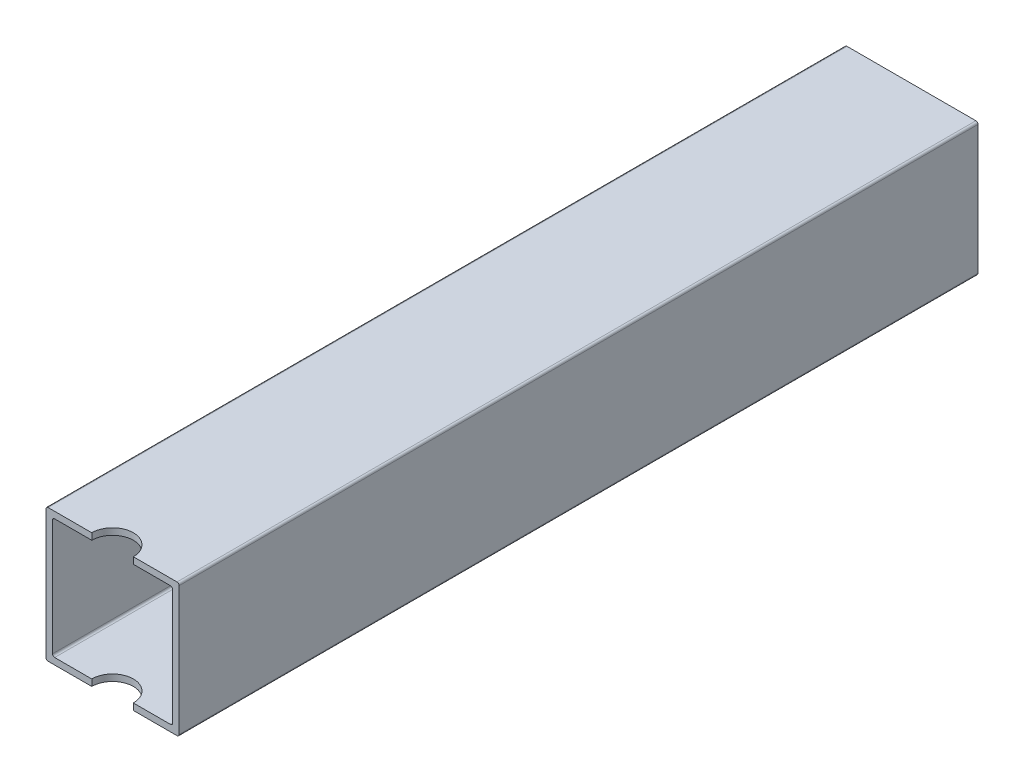
ISO-10303-21;
HEADER;
FILE_DESCRIPTION(('STEP AP214'),'2;1');
FILE_NAME('part.step','',(''),(''),'','','');
FILE_SCHEMA(('AUTOMOTIVE_DESIGN { 1 0 10303 214 1 1 1 1 }'));
ENDSEC;
DATA;
#1=APPLICATION_CONTEXT('core data for automotive mechanical design processes');
#2=APPLICATION_PROTOCOL_DEFINITION('international standard','automotive_design',2000,#1);
#3=PRODUCT_CONTEXT('',#1,'mechanical');
#4=PRODUCT('Part','Part','',(#3));
#5=PRODUCT_RELATED_PRODUCT_CATEGORY('part','',(#4));
#6=PRODUCT_DEFINITION_FORMATION('','',#4);
#7=PRODUCT_DEFINITION_CONTEXT('part definition',#1,'design');
#8=PRODUCT_DEFINITION('design','',#6,#7);
#9=PRODUCT_DEFINITION_SHAPE('','',#8);
#10=(LENGTH_UNIT() NAMED_UNIT(*) SI_UNIT(.MILLI.,.METRE.));
#11=(NAMED_UNIT(*) PLANE_ANGLE_UNIT() SI_UNIT($,.RADIAN.));
#12=(NAMED_UNIT(*) SI_UNIT($,.STERADIAN.) SOLID_ANGLE_UNIT());
#13=UNCERTAINTY_MEASURE_WITH_UNIT(LENGTH_MEASURE(1.E-05),#10,'distance_accuracy_value','');
#14=(GEOMETRIC_REPRESENTATION_CONTEXT(3) GLOBAL_UNCERTAINTY_ASSIGNED_CONTEXT((#13)) GLOBAL_UNIT_ASSIGNED_CONTEXT((#10,
#11,#12)) REPRESENTATION_CONTEXT('',''));
#15=CARTESIAN_POINT('',(0.,0.,0.));
#16=DIRECTION('',(0.,0.,1.));
#17=DIRECTION('',(1.,0.,0.));
#18=AXIS2_PLACEMENT_3D('',#15,#16,#17);
#19=CARTESIAN_POINT('',(0.,0.,0.));
#20=DIRECTION('',(0.,0.,-1.));
#21=DIRECTION('',(-1.,0.,0.));
#22=AXIS2_PLACEMENT_3D('',#19,#20,#21);
#23=PLANE('',#22);
#24=DIRECTION('',(1.,0.,0.));
#25=VECTOR('',#24,1.);
#26=CARTESIAN_POINT('',(0.,0.,0.));
#27=LINE('',#26,#25);
#28=CARTESIAN_POINT('',(0.4064,0.,0.));
#29=VERTEX_POINT('',#28);
#30=CARTESIAN_POINT('',(8.73125,0.,0.));
#31=VERTEX_POINT('',#30);
#32=EDGE_CURVE('E208',#29,#31,#27,.T.);
#33=ORIENTED_EDGE('',*,*,#32,.T.);
#34=DIRECTION('',(0.,1.,0.));
#35=VECTOR('',#34,1.);
#36=CARTESIAN_POINT('',(8.73125,0.,0.));
#37=LINE('',#36,#35);
#38=CARTESIAN_POINT('',(8.73125,1.2446,0.));
#39=VERTEX_POINT('',#38);
#40=EDGE_CURVE('E183',#31,#39,#37,.T.);
#41=ORIENTED_EDGE('',*,*,#40,.T.);
#42=DIRECTION('',(1.,0.,0.));
#43=VECTOR('',#42,1.);
#44=CARTESIAN_POINT('',(1.2446,1.2446,0.));
#45=LINE('',#44,#43);
#46=CARTESIAN_POINT('',(1.651,1.2446,0.));
#47=VERTEX_POINT('',#46);
#48=EDGE_CURVE('E355',#47,#39,#45,.T.);
#49=ORIENTED_EDGE('',*,*,#48,.F.);
#50=CARTESIAN_POINT('',(1.651,1.651,0.));
#51=DIRECTION('',(0.,0.,-1.));
#52=DIRECTION('',(-1.,0.,0.));
#53=AXIS2_PLACEMENT_3D('',#50,#51,#52);
#54=CIRCLE('',#53,0.4064);
#55=CARTESIAN_POINT('',(1.2446,1.651,0.));
#56=VERTEX_POINT('',#55);
#57=EDGE_CURVE('E325',#47,#56,#54,.T.);
#58=ORIENTED_EDGE('',*,*,#57,.T.);
#59=DIRECTION('',(0.,-1.,0.));
#60=VECTOR('',#59,1.);
#61=CARTESIAN_POINT('',(1.2446,1.2446,0.));
#62=LINE('',#61,#60);
#63=CARTESIAN_POINT('',(1.2446,23.749,0.));
#64=VERTEX_POINT('',#63);
#65=EDGE_CURVE('E354',#64,#56,#62,.T.);
#66=ORIENTED_EDGE('',*,*,#65,.F.);
#67=CARTESIAN_POINT('',(1.651,23.749,0.));
#68=DIRECTION('',(0.,0.,-1.));
#69=DIRECTION('',(-1.,0.,0.));
#70=AXIS2_PLACEMENT_3D('',#67,#68,#69);
#71=CIRCLE('',#70,0.4064);
#72=CARTESIAN_POINT('',(1.651,24.1554,0.));
#73=VERTEX_POINT('',#72);
#74=EDGE_CURVE('E306',#64,#73,#71,.T.);
#75=ORIENTED_EDGE('',*,*,#74,.T.);
#76=DIRECTION('',(-1.,0.,0.));
#77=VECTOR('',#76,1.);
#78=CARTESIAN_POINT('',(1.2446,24.1554,0.));
#79=LINE('',#78,#77);
#80=CARTESIAN_POINT('',(8.73125,24.1554,0.));
#81=VERTEX_POINT('',#80);
#82=EDGE_CURVE('E373',#81,#73,#79,.T.);
#83=ORIENTED_EDGE('',*,*,#82,.F.);
#84=CARTESIAN_POINT('',(8.73125,25.4,0.));
#85=VERTEX_POINT('',#84);
#86=EDGE_CURVE('E61',#81,#85,#37,.T.);
#87=ORIENTED_EDGE('',*,*,#86,.T.);
#88=DIRECTION('',(-1.,0.,0.));
#89=VECTOR('',#88,1.);
#90=CARTESIAN_POINT('',(0.,25.4,0.));
#91=LINE('',#90,#89);
#92=CARTESIAN_POINT('',(0.4064,25.4,0.));
#93=VERTEX_POINT('',#92);
#94=EDGE_CURVE('E222',#85,#93,#91,.T.);
#95=ORIENTED_EDGE('',*,*,#94,.T.);
#96=CARTESIAN_POINT('',(0.4064,24.9936,0.));
#97=DIRECTION('',(0.,0.,-1.));
#98=DIRECTION('',(-1.,0.,0.));
#99=AXIS2_PLACEMENT_3D('',#96,#97,#98);
#100=CIRCLE('',#99,0.4064);
#101=CARTESIAN_POINT('',(0.,24.9936,0.));
#102=VERTEX_POINT('',#101);
#103=EDGE_CURVE('E238',#93,#102,#100,.F.);
#104=ORIENTED_EDGE('',*,*,#103,.T.);
#105=DIRECTION('',(0.,-1.,0.));
#106=VECTOR('',#105,1.);
#107=CARTESIAN_POINT('',(0.,0.,0.));
#108=LINE('',#107,#106);
#109=CARTESIAN_POINT('',(0.,0.4064,0.));
#110=VERTEX_POINT('',#109);
#111=EDGE_CURVE('E209',#102,#110,#108,.T.);
#112=ORIENTED_EDGE('',*,*,#111,.T.);
#113=CARTESIAN_POINT('',(0.4064,0.4064,0.));
#114=DIRECTION('',(0.,0.,-1.));
#115=DIRECTION('',(-1.,0.,0.));
#116=AXIS2_PLACEMENT_3D('',#113,#114,#115);
#117=CIRCLE('',#116,0.4064);
#118=EDGE_CURVE('E244',#110,#29,#117,.F.);
#119=ORIENTED_EDGE('',*,*,#118,.T.);
#120=EDGE_LOOP('',(#33,#41,#49,#58,#66,#75,#83,#87,#95,#104,#112,#119));
#121=FACE_BOUND('',#120,.T.);
#122=ADVANCED_FACE('F45',(#121),#23,.F.);
#123=CARTESIAN_POINT('',(0.,0.,-152.4));
#124=DIRECTION('',(-1.,0.,0.));
#125=DIRECTION('',(0.,0.,1.));
#126=AXIS2_PLACEMENT_3D('',#123,#124,#125);
#127=PLANE('',#126);
#128=DIRECTION('',(0.,-1.,0.));
#129=VECTOR('',#128,1.);
#130=CARTESIAN_POINT('',(0.,0.,-152.4));
#131=LINE('',#130,#129);
#132=CARTESIAN_POINT('',(0.,24.9936,-152.4));
#133=VERTEX_POINT('',#132);
#134=CARTESIAN_POINT('',(0.,0.4064,-152.4));
#135=VERTEX_POINT('',#134);
#136=EDGE_CURVE('E226',#133,#135,#131,.T.);
#137=ORIENTED_EDGE('',*,*,#136,.T.);
#138=DIRECTION('',(0.,0.,1.));
#139=VECTOR('',#138,1.);
#140=CARTESIAN_POINT('',(0.,0.4064,-152.4));
#141=LINE('',#140,#139);
#142=EDGE_CURVE('E230',#135,#110,#141,.T.);
#143=ORIENTED_EDGE('',*,*,#142,.T.);
#144=ORIENTED_EDGE('',*,*,#111,.F.);
#145=DIRECTION('',(0.,0.,1.));
#146=VECTOR('',#145,1.);
#147=CARTESIAN_POINT('',(0.,24.9936,-152.4));
#148=LINE('',#147,#146);
#149=EDGE_CURVE('E227',#102,#133,#148,.F.);
#150=ORIENTED_EDGE('',*,*,#149,.T.);
#151=EDGE_LOOP('',(#137,#143,#144,#150));
#152=FACE_BOUND('',#151,.T.);
#153=ADVANCED_FACE('F405',(#152),#127,.T.);
#154=CARTESIAN_POINT('',(0.,25.4,-152.4));
#155=DIRECTION('',(0.,1.,0.));
#156=DIRECTION('',(0.,0.,1.));
#157=AXIS2_PLACEMENT_3D('',#154,#155,#156);
#158=PLANE('',#157);
#159=CARTESIAN_POINT('',(12.7,25.4,0.));
#160=DIRECTION('',(0.,1.,0.));
#161=DIRECTION('',(0.,0.,1.));
#162=AXIS2_PLACEMENT_3D('',#159,#160,#161);
#163=CIRCLE('',#162,3.96875);
#164=CARTESIAN_POINT('',(16.66875,25.4,0.));
#165=VERTEX_POINT('',#164);
#166=EDGE_CURVE('E189',#165,#85,#163,.T.);
#167=ORIENTED_EDGE('',*,*,#166,.F.);
#168=CARTESIAN_POINT('',(24.9936,25.4,0.));
#169=VERTEX_POINT('',#168);
#170=EDGE_CURVE('E223',#169,#165,#91,.T.);
#171=ORIENTED_EDGE('',*,*,#170,.F.);
#172=DIRECTION('',(0.,0.,1.));
#173=VECTOR('',#172,1.);
#174=CARTESIAN_POINT('',(24.9936,25.4,-152.4));
#175=LINE('',#174,#173);
#176=CARTESIAN_POINT('',(24.9936,25.4,-152.4));
#177=VERTEX_POINT('',#176);
#178=EDGE_CURVE('E271',#169,#177,#175,.F.);
#179=ORIENTED_EDGE('',*,*,#178,.T.);
#180=DIRECTION('',(-1.,0.,0.));
#181=VECTOR('',#180,1.);
#182=CARTESIAN_POINT('',(0.,25.4,-152.4));
#183=LINE('',#182,#181);
#184=CARTESIAN_POINT('',(0.4064,25.4,-152.4));
#185=VERTEX_POINT('',#184);
#186=EDGE_CURVE('E231',#177,#185,#183,.T.);
#187=ORIENTED_EDGE('',*,*,#186,.T.);
#188=DIRECTION('',(0.,0.,1.));
#189=VECTOR('',#188,1.);
#190=CARTESIAN_POINT('',(0.4064,25.4,-152.4));
#191=LINE('',#190,#189);
#192=EDGE_CURVE('E274',#185,#93,#191,.T.);
#193=ORIENTED_EDGE('',*,*,#192,.T.);
#194=ORIENTED_EDGE('',*,*,#94,.F.);
#195=EDGE_LOOP('',(#167,#171,#179,#187,#193,#194));
#196=FACE_BOUND('',#195,.T.);
#197=ADVANCED_FACE('F393',(#196),#158,.T.);
#198=CARTESIAN_POINT('',(25.4,0.,-152.4));
#199=DIRECTION('',(1.,0.,0.));
#200=DIRECTION('',(0.,0.,-1.));
#201=AXIS2_PLACEMENT_3D('',#198,#199,#200);
#202=PLANE('',#201);
#203=DIRECTION('',(0.,1.,0.));
#204=VECTOR('',#203,1.);
#205=CARTESIAN_POINT('',(25.4,0.,0.));
#206=LINE('',#205,#204);
#207=CARTESIAN_POINT('',(25.4,0.4064,0.));
#208=VERTEX_POINT('',#207);
#209=CARTESIAN_POINT('',(25.4,24.9936,0.));
#210=VERTEX_POINT('',#209);
#211=EDGE_CURVE('E213',#208,#210,#206,.T.);
#212=ORIENTED_EDGE('',*,*,#211,.F.);
#213=DIRECTION('',(0.,0.,1.));
#214=VECTOR('',#213,1.);
#215=CARTESIAN_POINT('',(25.4,0.4064,-152.4));
#216=LINE('',#215,#214);
#217=CARTESIAN_POINT('',(25.4,0.4064,-152.4));
#218=VERTEX_POINT('',#217);
#219=EDGE_CURVE('E268',#208,#218,#216,.F.);
#220=ORIENTED_EDGE('',*,*,#219,.T.);
#221=DIRECTION('',(0.,1.,0.));
#222=VECTOR('',#221,1.);
#223=CARTESIAN_POINT('',(25.4,0.,-152.4));
#224=LINE('',#223,#222);
#225=CARTESIAN_POINT('',(25.4,24.9936,-152.4));
#226=VERTEX_POINT('',#225);
#227=EDGE_CURVE('E384',#218,#226,#224,.T.);
#228=ORIENTED_EDGE('',*,*,#227,.T.);
#229=DIRECTION('',(0.,0.,1.));
#230=VECTOR('',#229,1.);
#231=CARTESIAN_POINT('',(25.4,24.9936,-152.4));
#232=LINE('',#231,#230);
#233=EDGE_CURVE('E264',#226,#210,#232,.T.);
#234=ORIENTED_EDGE('',*,*,#233,.T.);
#235=EDGE_LOOP('',(#212,#220,#228,#234));
#236=FACE_BOUND('',#235,.T.);
#237=ADVANCED_FACE('F420',(#236),#202,.T.);
#238=CARTESIAN_POINT('',(0.,0.,-152.4));
#239=DIRECTION('',(0.,-1.,0.));
#240=DIRECTION('',(0.,0.,-1.));
#241=AXIS2_PLACEMENT_3D('',#238,#239,#240);
#242=PLANE('',#241);
#243=CARTESIAN_POINT('',(12.7,0.,0.));
#244=DIRECTION('',(0.,1.,0.));
#245=DIRECTION('',(0.,0.,1.));
#246=AXIS2_PLACEMENT_3D('',#243,#244,#245);
#247=CIRCLE('',#246,3.96875);
#248=CARTESIAN_POINT('',(16.66875,0.,0.));
#249=VERTEX_POINT('',#248);
#250=EDGE_CURVE('E180',#249,#31,#247,.T.);
#251=ORIENTED_EDGE('',*,*,#250,.T.);
#252=ORIENTED_EDGE('',*,*,#32,.F.);
#253=DIRECTION('',(0.,0.,1.));
#254=VECTOR('',#253,1.);
#255=CARTESIAN_POINT('',(0.4064,0.,-152.4));
#256=LINE('',#255,#254);
#257=CARTESIAN_POINT('',(0.4064,0.,-152.4));
#258=VERTEX_POINT('',#257);
#259=EDGE_CURVE('E249',#29,#258,#256,.F.);
#260=ORIENTED_EDGE('',*,*,#259,.T.);
#261=DIRECTION('',(1.,0.,0.));
#262=VECTOR('',#261,1.);
#263=CARTESIAN_POINT('',(0.,0.,-152.4));
#264=LINE('',#263,#262);
#265=CARTESIAN_POINT('',(24.9936,0.,-152.4));
#266=VERTEX_POINT('',#265);
#267=EDGE_CURVE('E381',#258,#266,#264,.T.);
#268=ORIENTED_EDGE('',*,*,#267,.T.);
#269=DIRECTION('',(0.,0.,1.));
#270=VECTOR('',#269,1.);
#271=CARTESIAN_POINT('',(24.9936,0.,-152.4));
#272=LINE('',#271,#270);
#273=CARTESIAN_POINT('',(24.9936,0.,0.));
#274=VERTEX_POINT('',#273);
#275=EDGE_CURVE('E206',#266,#274,#272,.T.);
#276=ORIENTED_EDGE('',*,*,#275,.T.);
#277=EDGE_CURVE('E195',#249,#274,#27,.T.);
#278=ORIENTED_EDGE('',*,*,#277,.F.);
#279=EDGE_LOOP('',(#251,#252,#260,#268,#276,#278));
#280=FACE_BOUND('',#279,.T.);
#281=ADVANCED_FACE('F203',(#280),#242,.T.);
#282=CARTESIAN_POINT('',(0.,0.,-152.4));
#283=DIRECTION('',(0.,0.,-1.));
#284=DIRECTION('',(-1.,0.,0.));
#285=AXIS2_PLACEMENT_3D('',#282,#283,#284);
#286=PLANE('',#285);
#287=DIRECTION('',(-1.,0.,0.));
#288=VECTOR('',#287,1.);
#289=CARTESIAN_POINT('',(1.2446,24.1554,-152.4));
#290=LINE('',#289,#288);
#291=CARTESIAN_POINT('',(23.749,24.1554,-152.4));
#292=VERTEX_POINT('',#291);
#293=CARTESIAN_POINT('',(1.651,24.1554,-152.4));
#294=VERTEX_POINT('',#293);
#295=EDGE_CURVE('E215',#292,#294,#290,.T.);
#296=ORIENTED_EDGE('',*,*,#295,.T.);
#297=CARTESIAN_POINT('',(1.651,23.749,-152.4));
#298=DIRECTION('',(0.,0.,-1.));
#299=DIRECTION('',(-1.,0.,0.));
#300=AXIS2_PLACEMENT_3D('',#297,#298,#299);
#301=CIRCLE('',#300,0.4064);
#302=CARTESIAN_POINT('',(1.2446,23.749,-152.4));
#303=VERTEX_POINT('',#302);
#304=EDGE_CURVE('E310',#294,#303,#301,.F.);
#305=ORIENTED_EDGE('',*,*,#304,.T.);
#306=DIRECTION('',(0.,-1.,0.));
#307=VECTOR('',#306,1.);
#308=CARTESIAN_POINT('',(1.2446,1.2446,-152.4));
#309=LINE('',#308,#307);
#310=CARTESIAN_POINT('',(1.2446,1.651,-152.4));
#311=VERTEX_POINT('',#310);
#312=EDGE_CURVE('E339',#303,#311,#309,.T.);
#313=ORIENTED_EDGE('',*,*,#312,.T.);
#314=CARTESIAN_POINT('',(1.651,1.651,-152.4));
#315=DIRECTION('',(0.,0.,-1.));
#316=DIRECTION('',(-1.,0.,0.));
#317=AXIS2_PLACEMENT_3D('',#314,#315,#316);
#318=CIRCLE('',#317,0.4064);
#319=CARTESIAN_POINT('',(1.651,1.2446,-152.4));
#320=VERTEX_POINT('',#319);
#321=EDGE_CURVE('E54',#311,#320,#318,.F.);
#322=ORIENTED_EDGE('',*,*,#321,.T.);
#323=DIRECTION('',(1.,0.,0.));
#324=VECTOR('',#323,1.);
#325=CARTESIAN_POINT('',(1.2446,1.2446,-152.4));
#326=LINE('',#325,#324);
#327=CARTESIAN_POINT('',(23.749,1.2446,-152.4));
#328=VERTEX_POINT('',#327);
#329=EDGE_CURVE('E336',#320,#328,#326,.T.);
#330=ORIENTED_EDGE('',*,*,#329,.T.);
#331=CARTESIAN_POINT('',(23.749,1.651,-152.4));
#332=DIRECTION('',(0.,0.,-1.));
#333=DIRECTION('',(-1.,0.,0.));
#334=AXIS2_PLACEMENT_3D('',#331,#332,#333);
#335=CIRCLE('',#334,0.4064);
#336=CARTESIAN_POINT('',(24.1554,1.651,-152.4));
#337=VERTEX_POINT('',#336);
#338=EDGE_CURVE('E322',#328,#337,#335,.F.);
#339=ORIENTED_EDGE('',*,*,#338,.T.);
#340=DIRECTION('',(0.,1.,0.));
#341=VECTOR('',#340,1.);
#342=CARTESIAN_POINT('',(24.1554,1.2446,-152.4));
#343=LINE('',#342,#341);
#344=CARTESIAN_POINT('',(24.1554,23.749,-152.4));
#345=VERTEX_POINT('',#344);
#346=EDGE_CURVE('E349',#337,#345,#343,.T.);
#347=ORIENTED_EDGE('',*,*,#346,.T.);
#348=CARTESIAN_POINT('',(23.749,23.749,-152.4));
#349=DIRECTION('',(0.,0.,-1.));
#350=DIRECTION('',(-1.,0.,0.));
#351=AXIS2_PLACEMENT_3D('',#348,#349,#350);
#352=CIRCLE('',#351,0.4064);
#353=EDGE_CURVE('E316',#345,#292,#352,.F.);
#354=ORIENTED_EDGE('',*,*,#353,.T.);
#355=EDGE_LOOP('',(#296,#305,#313,#322,#330,#339,#347,#354));
#356=FACE_BOUND('',#355,.T.);
#357=ORIENTED_EDGE('',*,*,#267,.F.);
#358=CARTESIAN_POINT('',(0.4064,0.4064,-152.4));
#359=DIRECTION('',(0.,0.,-1.));
#360=DIRECTION('',(-1.,0.,0.));
#361=AXIS2_PLACEMENT_3D('',#358,#359,#360);
#362=CIRCLE('',#361,0.4064);
#363=EDGE_CURVE('E261',#258,#135,#362,.T.);
#364=ORIENTED_EDGE('',*,*,#363,.T.);
#365=ORIENTED_EDGE('',*,*,#136,.F.);
#366=CARTESIAN_POINT('',(0.4064,24.9936,-152.4));
#367=DIRECTION('',(0.,0.,-1.));
#368=DIRECTION('',(-1.,0.,0.));
#369=AXIS2_PLACEMENT_3D('',#366,#367,#368);
#370=CIRCLE('',#369,0.4064);
#371=EDGE_CURVE('E255',#133,#185,#370,.T.);
#372=ORIENTED_EDGE('',*,*,#371,.T.);
#373=ORIENTED_EDGE('',*,*,#186,.F.);
#374=CARTESIAN_POINT('',(24.9936,24.9936,-152.4));
#375=DIRECTION('',(0.,0.,-1.));
#376=DIRECTION('',(-1.,0.,0.));
#377=AXIS2_PLACEMENT_3D('',#374,#375,#376);
#378=CIRCLE('',#377,0.4064);
#379=EDGE_CURVE('E252',#177,#226,#378,.T.);
#380=ORIENTED_EDGE('',*,*,#379,.T.);
#381=ORIENTED_EDGE('',*,*,#227,.F.);
#382=CARTESIAN_POINT('',(24.9936,0.4064,-152.4));
#383=DIRECTION('',(0.,0.,-1.));
#384=DIRECTION('',(-1.,0.,0.));
#385=AXIS2_PLACEMENT_3D('',#382,#383,#384);
#386=CIRCLE('',#385,0.4064);
#387=EDGE_CURVE('E258',#218,#266,#386,.T.);
#388=ORIENTED_EDGE('',*,*,#387,.T.);
#389=EDGE_LOOP('',(#357,#364,#365,#372,#373,#380,#381,#388));
#390=FACE_BOUND('',#389,.T.);
#391=ADVANCED_FACE('F334',(#356,#390),#286,.T.);
#392=ORIENTED_EDGE('',*,*,#170,.T.);
#393=DIRECTION('',(0.,1.,0.));
#394=VECTOR('',#393,1.);
#395=CARTESIAN_POINT('',(16.66875,0.,0.));
#396=LINE('',#395,#394);
#397=CARTESIAN_POINT('',(16.66875,24.1554,0.));
#398=VERTEX_POINT('',#397);
#399=EDGE_CURVE('E201',#165,#398,#396,.F.);
#400=ORIENTED_EDGE('',*,*,#399,.T.);
#401=CARTESIAN_POINT('',(23.749,24.1554,0.));
#402=VERTEX_POINT('',#401);
#403=EDGE_CURVE('E374',#402,#398,#79,.T.);
#404=ORIENTED_EDGE('',*,*,#403,.F.);
#405=CARTESIAN_POINT('',(23.749,23.749,0.));
#406=DIRECTION('',(0.,0.,-1.));
#407=DIRECTION('',(-1.,0.,0.));
#408=AXIS2_PLACEMENT_3D('',#405,#406,#407);
#409=CIRCLE('',#408,0.4064);
#410=CARTESIAN_POINT('',(24.1554,23.749,0.));
#411=VERTEX_POINT('',#410);
#412=EDGE_CURVE('E313',#402,#411,#409,.T.);
#413=ORIENTED_EDGE('',*,*,#412,.T.);
#414=DIRECTION('',(0.,1.,0.));
#415=VECTOR('',#414,1.);
#416=CARTESIAN_POINT('',(24.1554,1.2446,0.));
#417=LINE('',#416,#415);
#418=CARTESIAN_POINT('',(24.1554,1.651,0.));
#419=VERTEX_POINT('',#418);
#420=EDGE_CURVE('E369',#419,#411,#417,.T.);
#421=ORIENTED_EDGE('',*,*,#420,.F.);
#422=CARTESIAN_POINT('',(23.749,1.651,0.));
#423=DIRECTION('',(0.,0.,-1.));
#424=DIRECTION('',(-1.,0.,0.));
#425=AXIS2_PLACEMENT_3D('',#422,#423,#424);
#426=CIRCLE('',#425,0.4064);
#427=CARTESIAN_POINT('',(23.749,1.2446,0.));
#428=VERTEX_POINT('',#427);
#429=EDGE_CURVE('E319',#419,#428,#426,.T.);
#430=ORIENTED_EDGE('',*,*,#429,.T.);
#431=CARTESIAN_POINT('',(16.66875,1.2446,0.));
#432=VERTEX_POINT('',#431);
#433=EDGE_CURVE('E198',#432,#428,#45,.T.);
#434=ORIENTED_EDGE('',*,*,#433,.F.);
#435=EDGE_CURVE('E69',#432,#249,#396,.F.);
#436=ORIENTED_EDGE('',*,*,#435,.T.);
#437=ORIENTED_EDGE('',*,*,#277,.T.);
#438=CARTESIAN_POINT('',(24.9936,0.4064,0.));
#439=DIRECTION('',(0.,0.,-1.));
#440=DIRECTION('',(-1.,0.,0.));
#441=AXIS2_PLACEMENT_3D('',#438,#439,#440);
#442=CIRCLE('',#441,0.4064);
#443=EDGE_CURVE('E241',#274,#208,#442,.F.);
#444=ORIENTED_EDGE('',*,*,#443,.T.);
#445=ORIENTED_EDGE('',*,*,#211,.T.);
#446=CARTESIAN_POINT('',(24.9936,24.9936,0.));
#447=DIRECTION('',(0.,0.,-1.));
#448=DIRECTION('',(-1.,0.,0.));
#449=AXIS2_PLACEMENT_3D('',#446,#447,#448);
#450=CIRCLE('',#449,0.4064);
#451=EDGE_CURVE('E235',#210,#169,#450,.F.);
#452=ORIENTED_EDGE('',*,*,#451,.T.);
#453=EDGE_LOOP('',(#392,#400,#404,#413,#421,#430,#434,#436,#437,#444,#445,#452));
#454=FACE_BOUND('',#453,.T.);
#455=ADVANCED_FACE('F194',(#454),#23,.F.);
#456=CARTESIAN_POINT('',(1.2446,1.2446,-152.4));
#457=DIRECTION('',(-1.,0.,0.));
#458=DIRECTION('',(0.,-1.,0.));
#459=AXIS2_PLACEMENT_3D('',#456,#457,#458);
#460=PLANE('',#459);
#461=ORIENTED_EDGE('',*,*,#312,.F.);
#462=DIRECTION('',(0.,0.,1.));
#463=VECTOR('',#462,1.);
#464=CARTESIAN_POINT('',(1.2446,23.749,0.));
#465=LINE('',#464,#463);
#466=EDGE_CURVE('E281',#303,#64,#465,.T.);
#467=ORIENTED_EDGE('',*,*,#466,.T.);
#468=ORIENTED_EDGE('',*,*,#65,.T.);
#469=DIRECTION('',(0.,0.,1.));
#470=VECTOR('',#469,1.);
#471=CARTESIAN_POINT('',(1.2446,1.651,-152.4));
#472=LINE('',#471,#470);
#473=EDGE_CURVE('E278',#56,#311,#472,.F.);
#474=ORIENTED_EDGE('',*,*,#473,.T.);
#475=EDGE_LOOP('',(#461,#467,#468,#474));
#476=FACE_BOUND('',#475,.T.);
#477=ADVANCED_FACE('F357',(#476),#460,.F.);
#478=CARTESIAN_POINT('',(1.2446,24.1554,-152.4));
#479=DIRECTION('',(0.,1.,0.));
#480=DIRECTION('',(0.,0.,1.));
#481=AXIS2_PLACEMENT_3D('',#478,#479,#480);
#482=PLANE('',#481);
#483=ORIENTED_EDGE('',*,*,#403,.T.);
#484=CARTESIAN_POINT('',(12.7,24.1554,0.));
#485=DIRECTION('',(0.,1.,0.));
#486=DIRECTION('',(0.,0.,1.));
#487=AXIS2_PLACEMENT_3D('',#484,#485,#486);
#488=CIRCLE('',#487,3.96875);
#489=EDGE_CURVE('E429',#398,#81,#488,.T.);
#490=ORIENTED_EDGE('',*,*,#489,.T.);
#491=ORIENTED_EDGE('',*,*,#82,.T.);
#492=DIRECTION('',(0.,0.,1.));
#493=VECTOR('',#492,1.);
#494=CARTESIAN_POINT('',(1.651,24.1554,-152.4));
#495=LINE('',#494,#493);
#496=EDGE_CURVE('E289',#73,#294,#495,.F.);
#497=ORIENTED_EDGE('',*,*,#496,.T.);
#498=ORIENTED_EDGE('',*,*,#295,.F.);
#499=DIRECTION('',(0.,0.,1.));
#500=VECTOR('',#499,1.);
#501=CARTESIAN_POINT('',(23.749,24.1554,0.));
#502=LINE('',#501,#500);
#503=EDGE_CURVE('E285',#292,#402,#502,.T.);
#504=ORIENTED_EDGE('',*,*,#503,.T.);
#505=EDGE_LOOP('',(#483,#490,#491,#497,#498,#504));
#506=FACE_BOUND('',#505,.T.);
#507=ADVANCED_FACE('F447',(#506),#482,.F.);
#508=CARTESIAN_POINT('',(24.1554,1.2446,-152.4));
#509=DIRECTION('',(1.,0.,0.));
#510=DIRECTION('',(0.,0.,-1.));
#511=AXIS2_PLACEMENT_3D('',#508,#509,#510);
#512=PLANE('',#511);
#513=ORIENTED_EDGE('',*,*,#420,.T.);
#514=DIRECTION('',(0.,0.,1.));
#515=VECTOR('',#514,1.);
#516=CARTESIAN_POINT('',(24.1554,23.749,-152.4));
#517=LINE('',#516,#515);
#518=EDGE_CURVE('E296',#411,#345,#517,.F.);
#519=ORIENTED_EDGE('',*,*,#518,.T.);
#520=ORIENTED_EDGE('',*,*,#346,.F.);
#521=DIRECTION('',(0.,0.,1.));
#522=VECTOR('',#521,1.);
#523=CARTESIAN_POINT('',(24.1554,1.651,0.));
#524=LINE('',#523,#522);
#525=EDGE_CURVE('E292',#337,#419,#524,.T.);
#526=ORIENTED_EDGE('',*,*,#525,.T.);
#527=EDGE_LOOP('',(#513,#519,#520,#526));
#528=FACE_BOUND('',#527,.T.);
#529=ADVANCED_FACE('F455',(#528),#512,.F.);
#530=CARTESIAN_POINT('',(1.2446,1.2446,-152.4));
#531=DIRECTION('',(0.,-1.,0.));
#532=DIRECTION('',(0.,0.,-1.));
#533=AXIS2_PLACEMENT_3D('',#530,#531,#532);
#534=PLANE('',#533);
#535=ORIENTED_EDGE('',*,*,#48,.T.);
#536=CARTESIAN_POINT('',(12.7,1.2446,0.));
#537=DIRECTION('',(0.,-1.,0.));
#538=DIRECTION('',(0.,0.,-1.));
#539=AXIS2_PLACEMENT_3D('',#536,#537,#538);
#540=CIRCLE('',#539,3.96875);
#541=EDGE_CURVE('E11',#39,#432,#540,.T.);
#542=ORIENTED_EDGE('',*,*,#541,.T.);
#543=ORIENTED_EDGE('',*,*,#433,.T.);
#544=DIRECTION('',(0.,0.,1.));
#545=VECTOR('',#544,1.);
#546=CARTESIAN_POINT('',(23.749,1.2446,-152.4));
#547=LINE('',#546,#545);
#548=EDGE_CURVE('E303',#428,#328,#547,.F.);
#549=ORIENTED_EDGE('',*,*,#548,.T.);
#550=ORIENTED_EDGE('',*,*,#329,.F.);
#551=DIRECTION('',(0.,0.,1.));
#552=VECTOR('',#551,1.);
#553=CARTESIAN_POINT('',(1.651,1.2446,0.));
#554=LINE('',#553,#552);
#555=EDGE_CURVE('E299',#320,#47,#554,.T.);
#556=ORIENTED_EDGE('',*,*,#555,.T.);
#557=EDGE_LOOP('',(#535,#542,#543,#549,#550,#556));
#558=FACE_BOUND('',#557,.T.);
#559=ADVANCED_FACE('F345',(#558),#534,.F.);
#560=CARTESIAN_POINT('',(0.4064,0.4064,-152.4));
#561=DIRECTION('',(0.,0.,1.));
#562=DIRECTION('',(1.,0.,0.));
#563=AXIS2_PLACEMENT_3D('',#560,#561,#562);
#564=CYLINDRICAL_SURFACE('',#563,0.4064);
#565=ORIENTED_EDGE('',*,*,#363,.F.);
#566=ORIENTED_EDGE('',*,*,#259,.F.);
#567=ORIENTED_EDGE('',*,*,#118,.F.);
#568=ORIENTED_EDGE('',*,*,#142,.F.);
#569=EDGE_LOOP('',(#565,#566,#567,#568));
#570=FACE_BOUND('',#569,.T.);
#571=ADVANCED_FACE('F410',(#570),#564,.T.);
#572=CARTESIAN_POINT('',(24.9936,0.4064,-152.4));
#573=DIRECTION('',(0.,0.,1.));
#574=DIRECTION('',(1.,0.,0.));
#575=AXIS2_PLACEMENT_3D('',#572,#573,#574);
#576=CYLINDRICAL_SURFACE('',#575,0.4064);
#577=ORIENTED_EDGE('',*,*,#387,.F.);
#578=ORIENTED_EDGE('',*,*,#219,.F.);
#579=ORIENTED_EDGE('',*,*,#443,.F.);
#580=ORIENTED_EDGE('',*,*,#275,.F.);
#581=EDGE_LOOP('',(#577,#578,#579,#580));
#582=FACE_BOUND('',#581,.T.);
#583=ADVANCED_FACE('F417',(#582),#576,.T.);
#584=CARTESIAN_POINT('',(0.4064,24.9936,-152.4));
#585=DIRECTION('',(0.,0.,1.));
#586=DIRECTION('',(1.,0.,0.));
#587=AXIS2_PLACEMENT_3D('',#584,#585,#586);
#588=CYLINDRICAL_SURFACE('',#587,0.4064);
#589=ORIENTED_EDGE('',*,*,#371,.F.);
#590=ORIENTED_EDGE('',*,*,#149,.F.);
#591=ORIENTED_EDGE('',*,*,#103,.F.);
#592=ORIENTED_EDGE('',*,*,#192,.F.);
#593=EDGE_LOOP('',(#589,#590,#591,#592));
#594=FACE_BOUND('',#593,.T.);
#595=ADVANCED_FACE('F401',(#594),#588,.T.);
#596=CARTESIAN_POINT('',(24.9936,24.9936,-152.4));
#597=DIRECTION('',(0.,0.,1.));
#598=DIRECTION('',(1.,0.,0.));
#599=AXIS2_PLACEMENT_3D('',#596,#597,#598);
#600=CYLINDRICAL_SURFACE('',#599,0.4064);
#601=ORIENTED_EDGE('',*,*,#379,.F.);
#602=ORIENTED_EDGE('',*,*,#178,.F.);
#603=ORIENTED_EDGE('',*,*,#451,.F.);
#604=ORIENTED_EDGE('',*,*,#233,.F.);
#605=EDGE_LOOP('',(#601,#602,#603,#604));
#606=FACE_BOUND('',#605,.T.);
#607=ADVANCED_FACE('F423',(#606),#600,.T.);
#608=CARTESIAN_POINT('',(1.651,23.749,-152.4));
#609=DIRECTION('',(0.,0.,-1.));
#610=DIRECTION('',(-1.,0.,0.));
#611=AXIS2_PLACEMENT_3D('',#608,#609,#610);
#612=CYLINDRICAL_SURFACE('',#611,0.4064);
#613=ORIENTED_EDGE('',*,*,#304,.F.);
#614=ORIENTED_EDGE('',*,*,#496,.F.);
#615=ORIENTED_EDGE('',*,*,#74,.F.);
#616=ORIENTED_EDGE('',*,*,#466,.F.);
#617=EDGE_LOOP('',(#613,#614,#615,#616));
#618=FACE_BOUND('',#617,.T.);
#619=ADVANCED_FACE('F444',(#618),#612,.F.);
#620=CARTESIAN_POINT('',(23.749,23.749,-152.4));
#621=DIRECTION('',(0.,0.,-1.));
#622=DIRECTION('',(-1.,0.,0.));
#623=AXIS2_PLACEMENT_3D('',#620,#621,#622);
#624=CYLINDRICAL_SURFACE('',#623,0.4064);
#625=ORIENTED_EDGE('',*,*,#353,.F.);
#626=ORIENTED_EDGE('',*,*,#518,.F.);
#627=ORIENTED_EDGE('',*,*,#412,.F.);
#628=ORIENTED_EDGE('',*,*,#503,.F.);
#629=EDGE_LOOP('',(#625,#626,#627,#628));
#630=FACE_BOUND('',#629,.T.);
#631=ADVANCED_FACE('F457',(#630),#624,.F.);
#632=CARTESIAN_POINT('',(23.749,1.651,-152.4));
#633=DIRECTION('',(0.,0.,-1.));
#634=DIRECTION('',(-1.,0.,0.));
#635=AXIS2_PLACEMENT_3D('',#632,#633,#634);
#636=CYLINDRICAL_SURFACE('',#635,0.4064);
#637=ORIENTED_EDGE('',*,*,#338,.F.);
#638=ORIENTED_EDGE('',*,*,#548,.F.);
#639=ORIENTED_EDGE('',*,*,#429,.F.);
#640=ORIENTED_EDGE('',*,*,#525,.F.);
#641=EDGE_LOOP('',(#637,#638,#639,#640));
#642=FACE_BOUND('',#641,.T.);
#643=ADVANCED_FACE('F459',(#642),#636,.F.);
#644=CARTESIAN_POINT('',(1.651,1.651,-152.4));
#645=DIRECTION('',(0.,0.,-1.));
#646=DIRECTION('',(-1.,0.,0.));
#647=AXIS2_PLACEMENT_3D('',#644,#645,#646);
#648=CYLINDRICAL_SURFACE('',#647,0.4064);
#649=ORIENTED_EDGE('',*,*,#321,.F.);
#650=ORIENTED_EDGE('',*,*,#473,.F.);
#651=ORIENTED_EDGE('',*,*,#57,.F.);
#652=ORIENTED_EDGE('',*,*,#555,.F.);
#653=EDGE_LOOP('',(#649,#650,#651,#652));
#654=FACE_BOUND('',#653,.T.);
#655=ADVANCED_FACE('F47',(#654),#648,.F.);
#656=CARTESIAN_POINT('',(12.7,0.,0.));
#657=DIRECTION('',(0.,1.,0.));
#658=DIRECTION('',(0.,0.,1.));
#659=AXIS2_PLACEMENT_3D('',#656,#657,#658);
#660=CYLINDRICAL_SURFACE('',#659,3.96875);
#661=ORIENTED_EDGE('',*,*,#250,.F.);
#662=ORIENTED_EDGE('',*,*,#435,.F.);
#663=ORIENTED_EDGE('',*,*,#541,.F.);
#664=ORIENTED_EDGE('',*,*,#40,.F.);
#665=EDGE_LOOP('',(#661,#662,#663,#664));
#666=FACE_BOUND('',#665,.T.);
#667=ADVANCED_FACE('F181',(#666),#660,.F.);
#668=ORIENTED_EDGE('',*,*,#489,.F.);
#669=ORIENTED_EDGE('',*,*,#399,.F.);
#670=ORIENTED_EDGE('',*,*,#166,.T.);
#671=ORIENTED_EDGE('',*,*,#86,.F.);
#672=EDGE_LOOP('',(#668,#669,#670,#671));
#673=FACE_BOUND('',#672,.T.);
#674=ADVANCED_FACE('F449',(#673),#660,.F.);
#675=CLOSED_SHELL('',(#122,#153,#197,#237,#281,#391,#455,#477,#507,#529,#559,#571,#583,#595,
#607,#619,#631,#643,#655,#667,#674));
#676=MANIFOLD_SOLID_BREP('B2',#675);
#677=ADVANCED_BREP_SHAPE_REPRESENTATION('',(#18,#676),#14);
#678=SHAPE_DEFINITION_REPRESENTATION(#9,#677);
ENDSEC;
END-ISO-10303-21;
